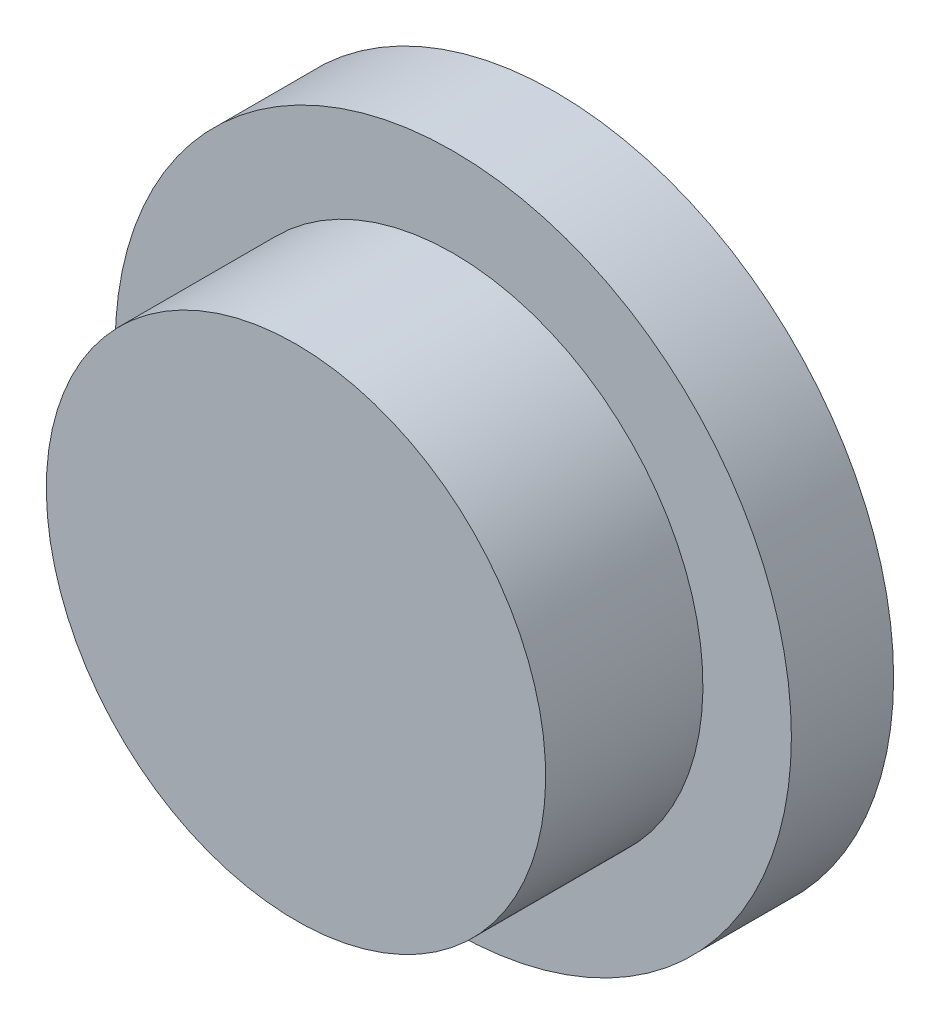
ISO-10303-21;
HEADER;
FILE_DESCRIPTION(('STEP AP214'),'2;1');
FILE_NAME('part.step','',(''),(''),'','','');
FILE_SCHEMA(('AUTOMOTIVE_DESIGN { 1 0 10303 214 1 1 1 1 }'));
ENDSEC;
DATA;
#1=APPLICATION_CONTEXT('core data for automotive mechanical design processes');
#2=APPLICATION_PROTOCOL_DEFINITION('international standard','automotive_design',2000,#1);
#3=PRODUCT_CONTEXT('',#1,'mechanical');
#4=PRODUCT('Part','Part','',(#3));
#5=PRODUCT_RELATED_PRODUCT_CATEGORY('part','',(#4));
#6=PRODUCT_DEFINITION_FORMATION('','',#4);
#7=PRODUCT_DEFINITION_CONTEXT('part definition',#1,'design');
#8=PRODUCT_DEFINITION('design','',#6,#7);
#9=PRODUCT_DEFINITION_SHAPE('','',#8);
#10=(LENGTH_UNIT() NAMED_UNIT(*) SI_UNIT(.MILLI.,.METRE.));
#11=(NAMED_UNIT(*) PLANE_ANGLE_UNIT() SI_UNIT($,.RADIAN.));
#12=(NAMED_UNIT(*) SI_UNIT($,.STERADIAN.) SOLID_ANGLE_UNIT());
#13=UNCERTAINTY_MEASURE_WITH_UNIT(LENGTH_MEASURE(1.E-05),#10,'distance_accuracy_value','');
#14=(GEOMETRIC_REPRESENTATION_CONTEXT(3) GLOBAL_UNCERTAINTY_ASSIGNED_CONTEXT((#13)) GLOBAL_UNIT_ASSIGNED_CONTEXT((#10,
#11,#12)) REPRESENTATION_CONTEXT('',''));
#15=CARTESIAN_POINT('',(0.,0.,0.));
#16=DIRECTION('',(0.,0.,1.));
#17=DIRECTION('',(1.,0.,0.));
#18=AXIS2_PLACEMENT_3D('',#15,#16,#17);
#19=CARTESIAN_POINT('',(0.,0.,0.));
#20=DIRECTION('',(0.,0.,1.));
#21=DIRECTION('',(0.,-1.,0.));
#22=AXIS2_PLACEMENT_3D('',#19,#20,#21);
#23=PLANE('',#22);
#24=CARTESIAN_POINT('',(0.,0.,0.));
#25=DIRECTION('',(0.,0.,-1.));
#26=DIRECTION('',(0.,1.,0.));
#27=AXIS2_PLACEMENT_3D('',#24,#25,#26);
#28=CIRCLE('',#27,31.75);
#29=CARTESIAN_POINT('',(0.,31.75,0.));
#30=VERTEX_POINT('',#29);
#31=EDGE_CURVE('E10',#30,#30,#28,.T.);
#32=ORIENTED_EDGE('',*,*,#31,.F.);
#33=EDGE_LOOP('',(#32));
#34=FACE_BOUND('',#33,.T.);
#35=ADVANCED_FACE('F33',(#34),#23,.T.);
#36=CARTESIAN_POINT('',(0.,0.,-6.));
#37=DIRECTION('',(0.,0.,-1.));
#38=DIRECTION('',(0.,1.,0.));
#39=AXIS2_PLACEMENT_3D('',#36,#37,#38);
#40=CYLINDRICAL_SURFACE('',#39,31.75);
#41=ORIENTED_EDGE('',*,*,#31,.T.);
#42=EDGE_LOOP('',(#41));
#43=FACE_BOUND('',#42,.T.);
#44=CARTESIAN_POINT('',(0.,0.,-20.));
#45=DIRECTION('',(0.,0.,-1.));
#46=DIRECTION('',(0.,1.,0.));
#47=AXIS2_PLACEMENT_3D('',#44,#45,#46);
#48=CIRCLE('',#47,31.75);
#49=CARTESIAN_POINT('',(0.,31.75,-20.));
#50=VERTEX_POINT('',#49);
#51=EDGE_CURVE('E39',#50,#50,#48,.T.);
#52=ORIENTED_EDGE('',*,*,#51,.F.);
#53=EDGE_LOOP('',(#52));
#54=FACE_BOUND('',#53,.T.);
#55=ADVANCED_FACE('F93',(#43,#54),#40,.T.);
#56=CARTESIAN_POINT('',(0.,31.75,-20.));
#57=DIRECTION('',(0.,0.,1.));
#58=DIRECTION('',(0.,-1.,0.));
#59=AXIS2_PLACEMENT_3D('',#56,#57,#58);
#60=PLANE('',#59);
#61=ORIENTED_EDGE('',*,*,#51,.T.);
#62=EDGE_LOOP('',(#61));
#63=FACE_BOUND('',#62,.T.);
#64=CARTESIAN_POINT('',(0.,0.,-20.));
#65=DIRECTION('',(0.,0.,-1.));
#66=DIRECTION('',(0.,1.,0.));
#67=AXIS2_PLACEMENT_3D('',#64,#65,#66);
#68=CIRCLE('',#67,43.);
#69=CARTESIAN_POINT('',(0.,43.,-20.));
#70=VERTEX_POINT('',#69);
#71=EDGE_CURVE('E43',#70,#70,#68,.T.);
#72=ORIENTED_EDGE('',*,*,#71,.F.);
#73=EDGE_LOOP('',(#72));
#74=FACE_BOUND('',#73,.T.);
#75=ADVANCED_FACE('F98',(#63,#74),#60,.T.);
#76=CARTESIAN_POINT('',(0.,0.,-6.));
#77=DIRECTION('',(0.,0.,-1.));
#78=DIRECTION('',(0.,1.,0.));
#79=AXIS2_PLACEMENT_3D('',#76,#77,#78);
#80=CYLINDRICAL_SURFACE('',#79,43.);
#81=ORIENTED_EDGE('',*,*,#71,.T.);
#82=EDGE_LOOP('',(#81));
#83=FACE_BOUND('',#82,.T.);
#84=CARTESIAN_POINT('',(0.,0.,-33.));
#85=DIRECTION('',(0.,0.,-1.));
#86=DIRECTION('',(0.,1.,0.));
#87=AXIS2_PLACEMENT_3D('',#84,#85,#86);
#88=CIRCLE('',#87,43.);
#89=CARTESIAN_POINT('',(0.,43.,-33.));
#90=VERTEX_POINT('',#89);
#91=EDGE_CURVE('E47',#90,#90,#88,.T.);
#92=ORIENTED_EDGE('',*,*,#91,.F.);
#93=EDGE_LOOP('',(#92));
#94=FACE_BOUND('',#93,.T.);
#95=ADVANCED_FACE('F102',(#83,#94),#80,.T.);
#96=CARTESIAN_POINT('',(0.,43.,-33.));
#97=DIRECTION('',(0.,0.,-1.));
#98=DIRECTION('',(0.,1.,0.));
#99=AXIS2_PLACEMENT_3D('',#96,#97,#98);
#100=PLANE('',#99);
#101=ORIENTED_EDGE('',*,*,#91,.T.);
#102=EDGE_LOOP('',(#101));
#103=FACE_BOUND('',#102,.T.);
#104=CARTESIAN_POINT('',(0.,0.,-33.));
#105=DIRECTION('',(0.,0.,-1.));
#106=DIRECTION('',(0.,1.,0.));
#107=AXIS2_PLACEMENT_3D('',#104,#105,#106);
#108=CIRCLE('',#107,40.);
#109=CARTESIAN_POINT('',(0.,40.,-33.));
#110=VERTEX_POINT('',#109);
#111=EDGE_CURVE('E52',#110,#110,#108,.T.);
#112=ORIENTED_EDGE('',*,*,#111,.F.);
#113=EDGE_LOOP('',(#112));
#114=FACE_BOUND('',#113,.T.);
#115=ADVANCED_FACE('F108',(#103,#114),#100,.T.);
#116=CARTESIAN_POINT('',(0.,0.,-6.));
#117=DIRECTION('',(0.,0.,-1.));
#118=DIRECTION('',(0.,1.,0.));
#119=AXIS2_PLACEMENT_3D('',#116,#117,#118);
#120=CYLINDRICAL_SURFACE('',#119,40.);
#121=ORIENTED_EDGE('',*,*,#111,.T.);
#122=EDGE_LOOP('',(#121));
#123=FACE_BOUND('',#122,.T.);
#124=CARTESIAN_POINT('',(0.,0.,-27.));
#125=DIRECTION('',(0.,0.,-1.));
#126=DIRECTION('',(0.,1.,0.));
#127=AXIS2_PLACEMENT_3D('',#124,#125,#126);
#128=CIRCLE('',#127,40.);
#129=CARTESIAN_POINT('',(0.,40.,-27.));
#130=VERTEX_POINT('',#129);
#131=EDGE_CURVE('E55',#130,#130,#128,.T.);
#132=ORIENTED_EDGE('',*,*,#131,.F.);
#133=EDGE_LOOP('',(#132));
#134=FACE_BOUND('',#133,.T.);
#135=ADVANCED_FACE('F112',(#123,#134),#120,.F.);
#136=CARTESIAN_POINT('',(0.,40.,-27.));
#137=DIRECTION('',(0.,0.,-1.));
#138=DIRECTION('',(0.,1.,0.));
#139=AXIS2_PLACEMENT_3D('',#136,#137,#138);
#140=PLANE('',#139);
#141=ORIENTED_EDGE('',*,*,#131,.T.);
#142=EDGE_LOOP('',(#141));
#143=FACE_BOUND('',#142,.T.);
#144=CARTESIAN_POINT('',(0.,0.,-27.));
#145=DIRECTION('',(0.,0.,-1.));
#146=DIRECTION('',(0.,1.,0.));
#147=AXIS2_PLACEMENT_3D('',#144,#145,#146);
#148=CIRCLE('',#147,37.);
#149=CARTESIAN_POINT('',(0.,37.,-27.));
#150=VERTEX_POINT('',#149);
#151=EDGE_CURVE('E58',#150,#150,#148,.T.);
#152=ORIENTED_EDGE('',*,*,#151,.F.);
#153=EDGE_LOOP('',(#152));
#154=FACE_BOUND('',#153,.T.);
#155=ADVANCED_FACE('F116',(#143,#154),#140,.T.);
#156=CARTESIAN_POINT('',(0.,0.,-6.));
#157=DIRECTION('',(0.,0.,-1.));
#158=DIRECTION('',(0.,1.,0.));
#159=AXIS2_PLACEMENT_3D('',#156,#157,#158);
#160=CYLINDRICAL_SURFACE('',#159,37.);
#161=ORIENTED_EDGE('',*,*,#151,.T.);
#162=EDGE_LOOP('',(#161));
#163=FACE_BOUND('',#162,.T.);
#164=CARTESIAN_POINT('',(0.,0.,-30.));
#165=DIRECTION('',(0.,0.,-1.));
#166=DIRECTION('',(0.,1.,0.));
#167=AXIS2_PLACEMENT_3D('',#164,#165,#166);
#168=CIRCLE('',#167,37.);
#169=CARTESIAN_POINT('',(0.,37.,-30.));
#170=VERTEX_POINT('',#169);
#171=EDGE_CURVE('E61',#170,#170,#168,.T.);
#172=ORIENTED_EDGE('',*,*,#171,.F.);
#173=EDGE_LOOP('',(#172));
#174=FACE_BOUND('',#173,.T.);
#175=ADVANCED_FACE('F120',(#163,#174),#160,.T.);
#176=CARTESIAN_POINT('',(0.,37.,-30.));
#177=DIRECTION('',(0.,0.,-1.));
#178=DIRECTION('',(0.,1.,0.));
#179=AXIS2_PLACEMENT_3D('',#176,#177,#178);
#180=PLANE('',#179);
#181=ORIENTED_EDGE('',*,*,#171,.T.);
#182=EDGE_LOOP('',(#181));
#183=FACE_BOUND('',#182,.T.);
#184=CARTESIAN_POINT('',(0.,0.,-30.));
#185=DIRECTION('',(0.,0.,-1.));
#186=DIRECTION('',(0.,1.,0.));
#187=AXIS2_PLACEMENT_3D('',#184,#185,#186);
#188=CIRCLE('',#187,27.);
#189=CARTESIAN_POINT('',(0.,27.,-30.));
#190=VERTEX_POINT('',#189);
#191=EDGE_CURVE('E64',#190,#190,#188,.T.);
#192=ORIENTED_EDGE('',*,*,#191,.F.);
#193=EDGE_LOOP('',(#192));
#194=FACE_BOUND('',#193,.T.);
#195=ADVANCED_FACE('F124',(#183,#194),#180,.T.);
#196=CARTESIAN_POINT('',(0.,0.,-2.99999999999998));
#197=DIRECTION('',(0.,0.,-1.));
#198=DIRECTION('',(0.,1.,0.));
#199=AXIS2_PLACEMENT_3D('',#196,#197,#198);
#200=CONICAL_SURFACE('',#199,19.,0.288055447050626);
#201=ORIENTED_EDGE('',*,*,#191,.T.);
#202=EDGE_LOOP('',(#201));
#203=FACE_BOUND('',#202,.T.);
#204=CARTESIAN_POINT('',(0.,0.,-2.99999999999998));
#205=DIRECTION('',(0.,0.,-1.));
#206=DIRECTION('',(0.,1.,0.));
#207=AXIS2_PLACEMENT_3D('',#204,#205,#206);
#208=CIRCLE('',#207,19.);
#209=CARTESIAN_POINT('',(0.,19.,-3.));
#210=VERTEX_POINT('',#209);
#211=EDGE_CURVE('E67',#210,#210,#208,.T.);
#212=ORIENTED_EDGE('',*,*,#211,.F.);
#213=EDGE_LOOP('',(#212));
#214=FACE_BOUND('',#213,.T.);
#215=ADVANCED_FACE('F89',(#203,#214),#200,.F.);
#216=CARTESIAN_POINT('',(0.,19.,-3.));
#217=DIRECTION('',(0.,0.,-1.));
#218=DIRECTION('',(0.,1.,0.));
#219=AXIS2_PLACEMENT_3D('',#216,#217,#218);
#220=PLANE('',#219);
#221=ORIENTED_EDGE('',*,*,#211,.T.);
#222=EDGE_LOOP('',(#221));
#223=FACE_BOUND('',#222,.T.);
#224=CARTESIAN_POINT('',(0.,0.,-2.99999999999999));
#225=DIRECTION('',(0.,0.,-1.));
#226=DIRECTION('',(0.,1.,0.));
#227=AXIS2_PLACEMENT_3D('',#224,#225,#226);
#228=CIRCLE('',#227,14.);
#229=CARTESIAN_POINT('',(0.,14.,-3.));
#230=VERTEX_POINT('',#229);
#231=EDGE_CURVE('E70',#230,#230,#228,.T.);
#232=ORIENTED_EDGE('',*,*,#231,.F.);
#233=EDGE_LOOP('',(#232));
#234=FACE_BOUND('',#233,.T.);
#235=ADVANCED_FACE('F81',(#223,#234),#220,.T.);
#236=CARTESIAN_POINT('',(0.,0.,-6.));
#237=DIRECTION('',(0.,0.,-1.));
#238=DIRECTION('',(0.,1.,0.));
#239=AXIS2_PLACEMENT_3D('',#236,#237,#238);
#240=CYLINDRICAL_SURFACE('',#239,14.);
#241=ORIENTED_EDGE('',*,*,#231,.T.);
#242=EDGE_LOOP('',(#241));
#243=FACE_BOUND('',#242,.T.);
#244=CARTESIAN_POINT('',(0.,0.,-5.99999999999999));
#245=DIRECTION('',(0.,0.,-1.));
#246=DIRECTION('',(0.,1.,0.));
#247=AXIS2_PLACEMENT_3D('',#244,#245,#246);
#248=CIRCLE('',#247,14.);
#249=CARTESIAN_POINT('',(0.,14.,-6.));
#250=VERTEX_POINT('',#249);
#251=EDGE_CURVE('E73',#250,#250,#248,.T.);
#252=ORIENTED_EDGE('',*,*,#251,.F.);
#253=EDGE_LOOP('',(#252));
#254=FACE_BOUND('',#253,.T.);
#255=ADVANCED_FACE('F79',(#243,#254),#240,.T.);
#256=CARTESIAN_POINT('',(0.,14.,-6.));
#257=DIRECTION('',(0.,0.,-1.));
#258=DIRECTION('',(0.,1.,0.));
#259=AXIS2_PLACEMENT_3D('',#256,#257,#258);
#260=PLANE('',#259);
#261=ORIENTED_EDGE('',*,*,#251,.T.);
#262=EDGE_LOOP('',(#261));
#263=FACE_BOUND('',#262,.T.);
#264=ADVANCED_FACE('F77',(#263),#260,.T.);
#265=CLOSED_SHELL('',(#35,#55,#75,#95,#115,#135,#155,#175,#195,#215,#235,#255,#264));
#266=MANIFOLD_SOLID_BREP('B2',#265);
#267=ADVANCED_BREP_SHAPE_REPRESENTATION('',(#18,#266),#14);
#268=SHAPE_DEFINITION_REPRESENTATION(#9,#267);
ENDSEC;
END-ISO-10303-21;
